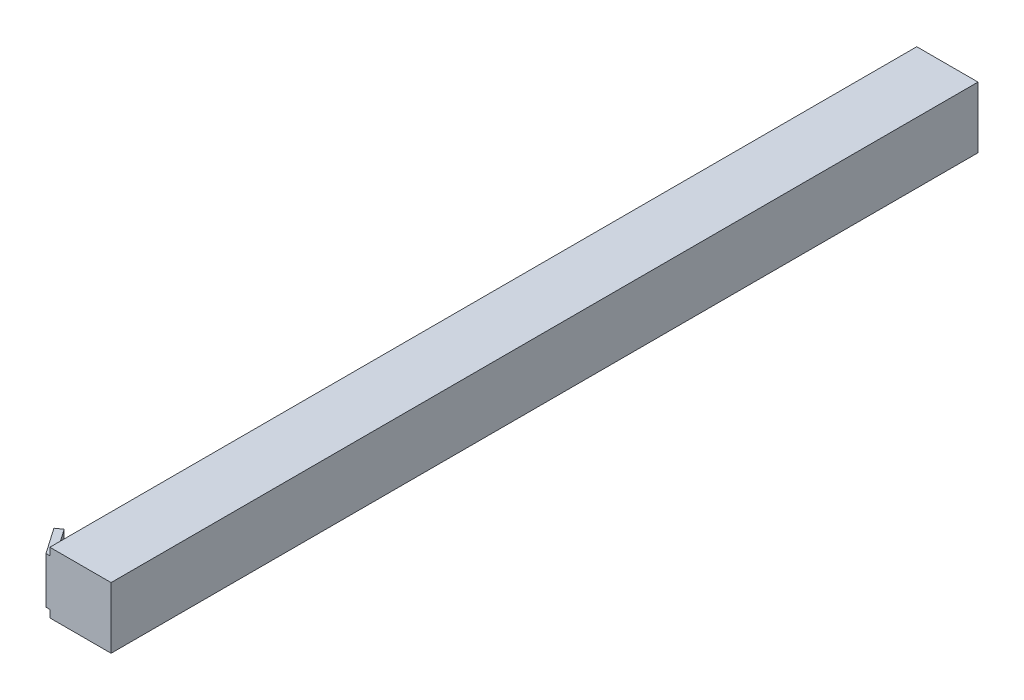
ISO-10303-21;
HEADER;
FILE_DESCRIPTION(('STEP AP214'),'2;1');
FILE_NAME('part.step','',(''),(''),'','','');
FILE_SCHEMA(('AUTOMOTIVE_DESIGN { 1 0 10303 214 1 1 1 1 }'));
ENDSEC;
DATA;
#1=APPLICATION_CONTEXT('core data for automotive mechanical design processes');
#2=APPLICATION_PROTOCOL_DEFINITION('international standard','automotive_design',2000,#1);
#3=PRODUCT_CONTEXT('',#1,'mechanical');
#4=PRODUCT('Part','Part','',(#3));
#5=PRODUCT_RELATED_PRODUCT_CATEGORY('part','',(#4));
#6=PRODUCT_DEFINITION_FORMATION('','',#4);
#7=PRODUCT_DEFINITION_CONTEXT('part definition',#1,'design');
#8=PRODUCT_DEFINITION('design','',#6,#7);
#9=PRODUCT_DEFINITION_SHAPE('','',#8);
#10=(LENGTH_UNIT() NAMED_UNIT(*) SI_UNIT(.MILLI.,.METRE.));
#11=(NAMED_UNIT(*) PLANE_ANGLE_UNIT() SI_UNIT($,.RADIAN.));
#12=(NAMED_UNIT(*) SI_UNIT($,.STERADIAN.) SOLID_ANGLE_UNIT());
#13=UNCERTAINTY_MEASURE_WITH_UNIT(LENGTH_MEASURE(1.E-05),#10,'distance_accuracy_value','');
#14=(GEOMETRIC_REPRESENTATION_CONTEXT(3) GLOBAL_UNCERTAINTY_ASSIGNED_CONTEXT((#13)) GLOBAL_UNIT_ASSIGNED_CONTEXT((#10,
#11,#12)) REPRESENTATION_CONTEXT('',''));
#15=CARTESIAN_POINT('',(0.,0.,0.));
#16=DIRECTION('',(0.,0.,1.));
#17=DIRECTION('',(1.,0.,0.));
#18=AXIS2_PLACEMENT_3D('',#15,#16,#17);
#19=CARTESIAN_POINT('',(0.,-2.,0.));
#20=DIRECTION('',(-1.,0.,0.));
#21=DIRECTION('',(0.,0.,1.));
#22=AXIS2_PLACEMENT_3D('',#19,#20,#21);
#23=PLANE('',#22);
#24=DIRECTION('',(0.,-1.,0.));
#25=VECTOR('',#24,1.);
#26=CARTESIAN_POINT('',(0.,12.6,-19.));
#27=LINE('',#26,#25);
#28=CARTESIAN_POINT('',(0.,0.000999999999999638,-19.));
#29=VERTEX_POINT('',#28);
#30=CARTESIAN_POINT('',(0.,0.,-19.));
#31=VERTEX_POINT('',#30);
#32=EDGE_CURVE('E219',#29,#31,#27,.T.);
#33=ORIENTED_EDGE('',*,*,#32,.F.);
#34=CARTESIAN_POINT('',(0.,0.000999999999999638,-20.999));
#35=DIRECTION('',(-1.,0.,0.));
#36=DIRECTION('',(0.,0.,1.));
#37=AXIS2_PLACEMENT_3D('',#34,#35,#36);
#38=CIRCLE('',#37,1.999);
#39=CARTESIAN_POINT('',(0.,2.,-20.999));
#40=VERTEX_POINT('',#39);
#41=EDGE_CURVE('E205',#29,#40,#38,.T.);
#42=ORIENTED_EDGE('',*,*,#41,.T.);
#43=DIRECTION('',(0.,0.,1.));
#44=VECTOR('',#43,1.);
#45=CARTESIAN_POINT('',(0.,2.,0.));
#46=LINE('',#45,#44);
#47=CARTESIAN_POINT('',(0.,2.,-233.));
#48=VERTEX_POINT('',#47);
#49=EDGE_CURVE('E286',#48,#40,#46,.T.);
#50=ORIENTED_EDGE('',*,*,#49,.F.);
#51=DIRECTION('',(0.,1.,0.));
#52=VECTOR('',#51,1.);
#53=CARTESIAN_POINT('',(0.,-2.,-233.));
#54=LINE('',#53,#52);
#55=CARTESIAN_POINT('',(0.,-2.,-233.));
#56=VERTEX_POINT('',#55);
#57=EDGE_CURVE('E259',#56,#48,#54,.T.);
#58=ORIENTED_EDGE('',*,*,#57,.F.);
#59=DIRECTION('',(0.,0.,1.));
#60=VECTOR('',#59,1.);
#61=CARTESIAN_POINT('',(0.,-2.,0.));
#62=LINE('',#61,#60);
#63=CARTESIAN_POINT('',(0.,-2.,2.));
#64=VERTEX_POINT('',#63);
#65=EDGE_CURVE('E239',#56,#64,#62,.T.);
#66=ORIENTED_EDGE('',*,*,#65,.T.);
#67=DIRECTION('',(0.,1.,0.));
#68=VECTOR('',#67,1.);
#69=CARTESIAN_POINT('',(0.,-2.,2.));
#70=LINE('',#69,#68);
#71=CARTESIAN_POINT('',(0.,0.,2.));
#72=VERTEX_POINT('',#71);
#73=EDGE_CURVE('E256',#64,#72,#70,.T.);
#74=ORIENTED_EDGE('',*,*,#73,.T.);
#75=DIRECTION('',(0.,0.,1.));
#76=VECTOR('',#75,1.);
#77=CARTESIAN_POINT('',(0.,0.,0.));
#78=LINE('',#77,#76);
#79=CARTESIAN_POINT('',(0.,0.,0.));
#80=VERTEX_POINT('',#79);
#81=EDGE_CURVE('E249',#80,#72,#78,.T.);
#82=ORIENTED_EDGE('',*,*,#81,.F.);
#83=EDGE_CURVE('E226',#31,#80,#78,.T.);
#84=ORIENTED_EDGE('',*,*,#83,.F.);
#85=EDGE_LOOP('',(#33,#42,#50,#58,#66,#74,#82,#84));
#86=FACE_BOUND('',#85,.T.);
#87=ADVANCED_FACE('F71',(#86),#23,.T.);
#88=CARTESIAN_POINT('',(0.,12.6,-19.));
#89=DIRECTION('',(0.,0.,1.));
#90=DIRECTION('',(1.,0.,0.));
#91=AXIS2_PLACEMENT_3D('',#88,#89,#90);
#92=PLANE('',#91);
#93=DIRECTION('',(0.,-1.,0.));
#94=VECTOR('',#93,1.);
#95=CARTESIAN_POINT('',(2.00000000000003,12.6,-19.));
#96=LINE('',#95,#94);
#97=CARTESIAN_POINT('',(2.00000000000003,0.000999999999999638,-19.));
#98=VERTEX_POINT('',#97);
#99=CARTESIAN_POINT('',(2.00000000000003,0.,-19.));
#100=VERTEX_POINT('',#99);
#101=EDGE_CURVE('E221',#98,#100,#96,.T.);
#102=ORIENTED_EDGE('',*,*,#101,.F.);
#103=DIRECTION('',(-1.,0.,0.));
#104=VECTOR('',#103,1.);
#105=CARTESIAN_POINT('',(4.,0.000999999999999638,-19.));
#106=LINE('',#105,#104);
#107=EDGE_CURVE('E208',#98,#29,#106,.T.);
#108=ORIENTED_EDGE('',*,*,#107,.T.);
#109=ORIENTED_EDGE('',*,*,#32,.T.);
#110=DIRECTION('',(-1.,0.,0.));
#111=VECTOR('',#110,1.);
#112=CARTESIAN_POINT('',(0.,0.,-19.));
#113=LINE('',#112,#111);
#114=EDGE_CURVE('E351',#100,#31,#113,.T.);
#115=ORIENTED_EDGE('',*,*,#114,.F.);
#116=EDGE_LOOP('',(#102,#108,#109,#115));
#117=FACE_BOUND('',#116,.T.);
#118=ADVANCED_FACE('F217',(#117),#92,.T.);
#119=CARTESIAN_POINT('',(2.00000000000003,12.6,0.));
#120=DIRECTION('',(-1.,0.,0.));
#121=DIRECTION('',(0.,0.,1.));
#122=AXIS2_PLACEMENT_3D('',#119,#120,#121);
#123=PLANE('',#122);
#124=CARTESIAN_POINT('',(2.00000000000003,0.000999999999999638,-20.999));
#125=DIRECTION('',(-1.,0.,0.));
#126=DIRECTION('',(0.,0.,1.));
#127=AXIS2_PLACEMENT_3D('',#124,#125,#126);
#128=CIRCLE('',#127,1.999);
#129=CARTESIAN_POINT('',(2.00000000000003,2.,-20.999));
#130=VERTEX_POINT('',#129);
#131=EDGE_CURVE('E93',#98,#130,#128,.T.);
#132=ORIENTED_EDGE('',*,*,#131,.F.);
#133=ORIENTED_EDGE('',*,*,#101,.T.);
#134=DIRECTION('',(0.,0.,-1.));
#135=VECTOR('',#134,1.);
#136=CARTESIAN_POINT('',(2.00000000000003,0.,0.));
#137=LINE('',#136,#135);
#138=CARTESIAN_POINT('',(2.,0.,-233.));
#139=VERTEX_POINT('',#138);
#140=EDGE_CURVE('E356',#100,#139,#137,.T.);
#141=ORIENTED_EDGE('',*,*,#140,.T.);
#142=DIRECTION('',(0.,-1.,0.));
#143=VECTOR('',#142,1.);
#144=CARTESIAN_POINT('',(2.,12.6,-233.));
#145=LINE('',#144,#143);
#146=CARTESIAN_POINT('',(2.,2.,-233.));
#147=VERTEX_POINT('',#146);
#148=EDGE_CURVE('E272',#147,#139,#145,.T.);
#149=ORIENTED_EDGE('',*,*,#148,.F.);
#150=DIRECTION('',(0.,0.,1.));
#151=VECTOR('',#150,1.);
#152=CARTESIAN_POINT('',(2.00000000000003,2.,0.));
#153=LINE('',#152,#151);
#154=EDGE_CURVE('E266',#147,#130,#153,.T.);
#155=ORIENTED_EDGE('',*,*,#154,.T.);
#156=EDGE_LOOP('',(#132,#133,#141,#149,#155));
#157=FACE_BOUND('',#156,.T.);
#158=ADVANCED_FACE('F270',(#157),#123,.F.);
#159=CARTESIAN_POINT('',(0.,12.599,-20.999));
#160=DIRECTION('',(-1.,0.,0.));
#161=DIRECTION('',(0.,0.,1.));
#162=AXIS2_PLACEMENT_3D('',#159,#160,#161);
#163=CIRCLE('',#162,1.999);
#164=CARTESIAN_POINT('',(0.,12.599,-19.));
#165=VERTEX_POINT('',#164);
#166=CARTESIAN_POINT('',(0.,10.6,-20.999));
#167=VERTEX_POINT('',#166);
#168=EDGE_CURVE('E85',#165,#167,#163,.F.);
#169=ORIENTED_EDGE('',*,*,#168,.F.);
#170=CARTESIAN_POINT('',(0.,12.6,-19.));
#171=VERTEX_POINT('',#170);
#172=EDGE_CURVE('E227',#171,#165,#27,.T.);
#173=ORIENTED_EDGE('',*,*,#172,.F.);
#174=DIRECTION('',(0.,0.,1.));
#175=VECTOR('',#174,1.);
#176=CARTESIAN_POINT('',(0.,12.6,-233.));
#177=LINE('',#176,#175);
#178=CARTESIAN_POINT('',(0.,12.6,0.));
#179=VERTEX_POINT('',#178);
#180=EDGE_CURVE('E279',#171,#179,#177,.T.);
#181=ORIENTED_EDGE('',*,*,#180,.T.);
#182=DIRECTION('',(0.,0.,-1.));
#183=VECTOR('',#182,1.);
#184=CARTESIAN_POINT('',(0.,12.6,0.));
#185=LINE('',#184,#183);
#186=CARTESIAN_POINT('',(0.,12.6,2.));
#187=VERTEX_POINT('',#186);
#188=EDGE_CURVE('E253',#187,#179,#185,.T.);
#189=ORIENTED_EDGE('',*,*,#188,.F.);
#190=DIRECTION('',(0.,-1.,0.));
#191=VECTOR('',#190,1.);
#192=CARTESIAN_POINT('',(0.,14.6,2.));
#193=LINE('',#192,#191);
#194=CARTESIAN_POINT('',(0.,14.6,2.));
#195=VERTEX_POINT('',#194);
#196=EDGE_CURVE('E302',#195,#187,#193,.T.);
#197=ORIENTED_EDGE('',*,*,#196,.F.);
#198=DIRECTION('',(0.,0.,1.));
#199=VECTOR('',#198,1.);
#200=CARTESIAN_POINT('',(0.,14.6,-233.));
#201=LINE('',#200,#199);
#202=CARTESIAN_POINT('',(0.,14.6,-233.));
#203=VERTEX_POINT('',#202);
#204=EDGE_CURVE('E291',#203,#195,#201,.T.);
#205=ORIENTED_EDGE('',*,*,#204,.F.);
#206=CARTESIAN_POINT('',(0.,10.6,-233.));
#207=VERTEX_POINT('',#206);
#208=EDGE_CURVE('E246',#207,#203,#54,.T.);
#209=ORIENTED_EDGE('',*,*,#208,.F.);
#210=DIRECTION('',(0.,0.,-1.));
#211=VECTOR('',#210,1.);
#212=CARTESIAN_POINT('',(0.,10.6,0.));
#213=LINE('',#212,#211);
#214=EDGE_CURVE('E388',#167,#207,#213,.T.);
#215=ORIENTED_EDGE('',*,*,#214,.F.);
#216=EDGE_LOOP('',(#169,#173,#181,#189,#197,#205,#209,#215));
#217=FACE_BOUND('',#216,.T.);
#218=ADVANCED_FACE('F393',(#217),#23,.T.);
#219=ORIENTED_EDGE('',*,*,#172,.T.);
#220=DIRECTION('',(-1.,0.,0.));
#221=VECTOR('',#220,1.);
#222=CARTESIAN_POINT('',(4.,12.599,-19.));
#223=LINE('',#222,#221);
#224=CARTESIAN_POINT('',(2.00000000000003,12.599,-19.));
#225=VERTEX_POINT('',#224);
#226=EDGE_CURVE('E213',#225,#165,#223,.T.);
#227=ORIENTED_EDGE('',*,*,#226,.F.);
#228=CARTESIAN_POINT('',(2.00000000000003,12.6,-19.));
#229=VERTEX_POINT('',#228);
#230=EDGE_CURVE('E228',#229,#225,#96,.T.);
#231=ORIENTED_EDGE('',*,*,#230,.F.);
#232=DIRECTION('',(-1.,0.,0.));
#233=VECTOR('',#232,1.);
#234=CARTESIAN_POINT('',(0.,12.6,-19.));
#235=LINE('',#234,#233);
#236=EDGE_CURVE('E352',#229,#171,#235,.T.);
#237=ORIENTED_EDGE('',*,*,#236,.T.);
#238=EDGE_LOOP('',(#219,#227,#231,#237));
#239=FACE_BOUND('',#238,.T.);
#240=ADVANCED_FACE('F414',(#239),#92,.T.);
#241=ORIENTED_EDGE('',*,*,#230,.T.);
#242=CARTESIAN_POINT('',(2.00000000000003,12.599,-20.999));
#243=DIRECTION('',(-1.,0.,0.));
#244=DIRECTION('',(0.,0.,1.));
#245=AXIS2_PLACEMENT_3D('',#242,#243,#244);
#246=CIRCLE('',#245,1.999);
#247=CARTESIAN_POINT('',(2.00000000000001,10.6,-20.999));
#248=VERTEX_POINT('',#247);
#249=EDGE_CURVE('E384',#225,#248,#246,.F.);
#250=ORIENTED_EDGE('',*,*,#249,.T.);
#251=DIRECTION('',(0.,0.,-1.));
#252=VECTOR('',#251,1.);
#253=CARTESIAN_POINT('',(2.00000000000003,10.6,0.));
#254=LINE('',#253,#252);
#255=CARTESIAN_POINT('',(2.,10.6,-233.));
#256=VERTEX_POINT('',#255);
#257=EDGE_CURVE('E264',#248,#256,#254,.T.);
#258=ORIENTED_EDGE('',*,*,#257,.T.);
#259=CARTESIAN_POINT('',(2.,12.6,-233.));
#260=VERTEX_POINT('',#259);
#261=EDGE_CURVE('E360',#260,#256,#145,.T.);
#262=ORIENTED_EDGE('',*,*,#261,.F.);
#263=DIRECTION('',(0.,0.,-1.));
#264=VECTOR('',#263,1.);
#265=CARTESIAN_POINT('',(2.00000000000003,12.6,0.));
#266=LINE('',#265,#264);
#267=EDGE_CURVE('E355',#229,#260,#266,.T.);
#268=ORIENTED_EDGE('',*,*,#267,.F.);
#269=EDGE_LOOP('',(#241,#250,#258,#262,#268));
#270=FACE_BOUND('',#269,.T.);
#271=ADVANCED_FACE('F380',(#270),#123,.F.);
#272=CARTESIAN_POINT('',(4.,10.6,0.));
#273=DIRECTION('',(0.,1.,0.));
#274=DIRECTION('',(0.,0.,1.));
#275=AXIS2_PLACEMENT_3D('',#272,#273,#274);
#276=PLANE('',#275);
#277=DIRECTION('',(-1.,0.,0.));
#278=VECTOR('',#277,1.);
#279=CARTESIAN_POINT('',(4.,10.6,-20.999));
#280=LINE('',#279,#278);
#281=EDGE_CURVE('E12',#167,#248,#280,.F.);
#282=ORIENTED_EDGE('',*,*,#281,.F.);
#283=ORIENTED_EDGE('',*,*,#214,.T.);
#284=DIRECTION('',(-1.,0.,0.));
#285=VECTOR('',#284,1.);
#286=CARTESIAN_POINT('',(4.,10.6,-233.));
#287=LINE('',#286,#285);
#288=EDGE_CURVE('E280',#256,#207,#287,.T.);
#289=ORIENTED_EDGE('',*,*,#288,.F.);
#290=ORIENTED_EDGE('',*,*,#257,.F.);
#291=EDGE_LOOP('',(#282,#283,#289,#290));
#292=FACE_BOUND('',#291,.T.);
#293=ADVANCED_FACE('F386',(#292),#276,.F.);
#294=CARTESIAN_POINT('',(4.,2.,0.));
#295=DIRECTION('',(0.,-1.,0.));
#296=DIRECTION('',(0.,0.,-1.));
#297=AXIS2_PLACEMENT_3D('',#294,#295,#296);
#298=PLANE('',#297);
#299=DIRECTION('',(-1.,0.,0.));
#300=VECTOR('',#299,1.);
#301=CARTESIAN_POINT('',(4.,2.,-20.999));
#302=LINE('',#301,#300);
#303=EDGE_CURVE('E79',#130,#40,#302,.T.);
#304=ORIENTED_EDGE('',*,*,#303,.F.);
#305=ORIENTED_EDGE('',*,*,#154,.F.);
#306=DIRECTION('',(-1.,0.,0.));
#307=VECTOR('',#306,1.);
#308=CARTESIAN_POINT('',(4.,2.,-233.));
#309=LINE('',#308,#307);
#310=EDGE_CURVE('E276',#147,#48,#309,.T.);
#311=ORIENTED_EDGE('',*,*,#310,.T.);
#312=ORIENTED_EDGE('',*,*,#49,.T.);
#313=EDGE_LOOP('',(#304,#305,#311,#312));
#314=FACE_BOUND('',#313,.T.);
#315=ADVANCED_FACE('F275',(#314),#298,.F.);
#316=CARTESIAN_POINT('',(0.,12.6,0.));
#317=DIRECTION('',(0.,1.,0.));
#318=DIRECTION('',(0.,0.,1.));
#319=AXIS2_PLACEMENT_3D('',#316,#317,#318);
#320=PLANE('',#319);
#321=DIRECTION('',(1.,0.,0.));
#322=VECTOR('',#321,1.);
#323=CARTESIAN_POINT('',(0.,12.6,2.));
#324=LINE('',#323,#322);
#325=CARTESIAN_POINT('',(-1.0456065278763,12.6,2.));
#326=VERTEX_POINT('',#325);
#327=EDGE_CURVE('E309',#326,#187,#324,.T.);
#328=ORIENTED_EDGE('',*,*,#327,.T.);
#329=ORIENTED_EDGE('',*,*,#188,.T.);
#330=DIRECTION('',(-0.570693062917517,0.,-0.82116345993829));
#331=VECTOR('',#330,1.);
#332=CARTESIAN_POINT('',(0.,12.6,0.));
#333=LINE('',#332,#331);
#334=CARTESIAN_POINT('',(-4.28019797188137,12.6,-6.15872594953717));
#335=VERTEX_POINT('',#334);
#336=EDGE_CURVE('E317',#179,#335,#333,.T.);
#337=ORIENTED_EDGE('',*,*,#336,.T.);
#338=DIRECTION('',(-0.82116345993829,0.,0.570693062917517));
#339=VECTOR('',#338,1.);
#340=CARTESIAN_POINT('',(-4.28019797188138,12.6,-6.15872594953717));
#341=LINE('',#340,#339);
#342=CARTESIAN_POINT('',(-5.92252489175796,12.6,-5.01733982370213));
#343=VERTEX_POINT('',#342);
#344=EDGE_CURVE('E319',#335,#343,#341,.T.);
#345=ORIENTED_EDGE('',*,*,#344,.T.);
#346=DIRECTION('',(0.570693062917517,0.,0.82116345993829));
#347=VECTOR('',#346,1.);
#348=CARTESIAN_POINT('',(-1.64232691987658,12.6,1.14138612583504));
#349=LINE('',#348,#347);
#350=EDGE_CURVE('E321',#343,#326,#349,.T.);
#351=ORIENTED_EDGE('',*,*,#350,.T.);
#352=EDGE_LOOP('',(#328,#329,#337,#345,#351));
#353=FACE_BOUND('',#352,.T.);
#354=ADVANCED_FACE('F417',(#353),#320,.T.);
#355=CARTESIAN_POINT('',(0.,0.,0.));
#356=DIRECTION('',(0.,1.,0.));
#357=DIRECTION('',(0.,0.,1.));
#358=AXIS2_PLACEMENT_3D('',#355,#356,#357);
#359=PLANE('',#358);
#360=CARTESIAN_POINT('',(0.127994310885294,0.,-14.4714396699896));
#361=DIRECTION('',(0.,1.,0.));
#362=DIRECTION('',(0.,0.,1.));
#363=AXIS2_PLACEMENT_3D('',#360,#361,#362);
#364=CIRCLE('',#363,14.4720056891147);
#365=CARTESIAN_POINT('',(14.6,0.,-14.4714396699896));
#366=VERTEX_POINT('',#365);
#367=EDGE_CURVE('E329',#366,#80,#364,.F.);
#368=ORIENTED_EDGE('',*,*,#367,.F.);
#369=DIRECTION('',(0.,0.,1.));
#370=VECTOR('',#369,1.);
#371=CARTESIAN_POINT('',(14.6,0.,0.));
#372=LINE('',#371,#370);
#373=CARTESIAN_POINT('',(14.6,0.,-233.));
#374=VERTEX_POINT('',#373);
#375=EDGE_CURVE('E326',#374,#366,#372,.T.);
#376=ORIENTED_EDGE('',*,*,#375,.F.);
#377=DIRECTION('',(1.,0.,0.));
#378=VECTOR('',#377,1.);
#379=CARTESIAN_POINT('',(0.,0.,-233.));
#380=LINE('',#379,#378);
#381=EDGE_CURVE('E231',#139,#374,#380,.T.);
#382=ORIENTED_EDGE('',*,*,#381,.F.);
#383=ORIENTED_EDGE('',*,*,#140,.F.);
#384=ORIENTED_EDGE('',*,*,#114,.T.);
#385=ORIENTED_EDGE('',*,*,#83,.T.);
#386=EDGE_LOOP('',(#368,#376,#382,#383,#384,#385));
#387=FACE_BOUND('',#386,.T.);
#388=ADVANCED_FACE('F366',(#387),#359,.T.);
#389=CARTESIAN_POINT('',(0.,-2.,-233.));
#390=DIRECTION('',(0.,0.,1.));
#391=DIRECTION('',(1.,0.,0.));
#392=AXIS2_PLACEMENT_3D('',#389,#390,#391);
#393=PLANE('',#392);
#394=ORIENTED_EDGE('',*,*,#57,.T.);
#395=ORIENTED_EDGE('',*,*,#310,.F.);
#396=ORIENTED_EDGE('',*,*,#148,.T.);
#397=ORIENTED_EDGE('',*,*,#381,.T.);
#398=DIRECTION('',(0.,-1.,0.));
#399=VECTOR('',#398,1.);
#400=CARTESIAN_POINT('',(14.6,12.6,-233.));
#401=LINE('',#400,#399);
#402=CARTESIAN_POINT('',(14.6,12.6,-233.));
#403=VERTEX_POINT('',#402);
#404=EDGE_CURVE('E349',#403,#374,#401,.T.);
#405=ORIENTED_EDGE('',*,*,#404,.F.);
#406=DIRECTION('',(-1.,0.,0.));
#407=VECTOR('',#406,1.);
#408=CARTESIAN_POINT('',(0.,12.6,-233.));
#409=LINE('',#408,#407);
#410=EDGE_CURVE('E283',#403,#260,#409,.T.);
#411=ORIENTED_EDGE('',*,*,#410,.T.);
#412=ORIENTED_EDGE('',*,*,#261,.T.);
#413=ORIENTED_EDGE('',*,*,#288,.T.);
#414=ORIENTED_EDGE('',*,*,#208,.T.);
#415=DIRECTION('',(-1.,0.,0.));
#416=VECTOR('',#415,1.);
#417=CARTESIAN_POINT('',(0.,14.6,-233.));
#418=LINE('',#417,#416);
#419=CARTESIAN_POINT('',(16.6,14.6,-233.));
#420=VERTEX_POINT('',#419);
#421=EDGE_CURVE('E300',#420,#203,#418,.T.);
#422=ORIENTED_EDGE('',*,*,#421,.F.);
#423=DIRECTION('',(0.,1.,0.));
#424=VECTOR('',#423,1.);
#425=CARTESIAN_POINT('',(16.6,-2.,-233.));
#426=LINE('',#425,#424);
#427=CARTESIAN_POINT('',(16.6,-2.,-233.));
#428=VERTEX_POINT('',#427);
#429=EDGE_CURVE('E251',#428,#420,#426,.T.);
#430=ORIENTED_EDGE('',*,*,#429,.F.);
#431=DIRECTION('',(1.,0.,0.));
#432=VECTOR('',#431,1.);
#433=CARTESIAN_POINT('',(0.,-2.,-233.));
#434=LINE('',#433,#432);
#435=EDGE_CURVE('E236',#56,#428,#434,.T.);
#436=ORIENTED_EDGE('',*,*,#435,.F.);
#437=EDGE_LOOP('',(#394,#395,#396,#397,#405,#411,#412,#413,#414,#422,#430,#436));
#438=FACE_BOUND('',#437,.T.);
#439=ADVANCED_FACE('F73',(#438),#393,.F.);
#440=CARTESIAN_POINT('',(16.6,-2.,0.));
#441=DIRECTION('',(-1.,0.,0.));
#442=DIRECTION('',(0.,0.,1.));
#443=AXIS2_PLACEMENT_3D('',#440,#441,#442);
#444=PLANE('',#443);
#445=ORIENTED_EDGE('',*,*,#429,.T.);
#446=DIRECTION('',(0.,0.,-1.));
#447=VECTOR('',#446,1.);
#448=CARTESIAN_POINT('',(16.6,14.6,-233.));
#449=LINE('',#448,#447);
#450=CARTESIAN_POINT('',(16.6,14.6,2.));
#451=VERTEX_POINT('',#450);
#452=EDGE_CURVE('E297',#451,#420,#449,.T.);
#453=ORIENTED_EDGE('',*,*,#452,.F.);
#454=DIRECTION('',(0.,1.,0.));
#455=VECTOR('',#454,1.);
#456=CARTESIAN_POINT('',(16.6,-2.,2.));
#457=LINE('',#456,#455);
#458=CARTESIAN_POINT('',(16.6,-2.,2.));
#459=VERTEX_POINT('',#458);
#460=EDGE_CURVE('E254',#459,#451,#457,.T.);
#461=ORIENTED_EDGE('',*,*,#460,.F.);
#462=DIRECTION('',(0.,0.,1.));
#463=VECTOR('',#462,1.);
#464=CARTESIAN_POINT('',(16.6,-2.,0.));
#465=LINE('',#464,#463);
#466=EDGE_CURVE('E244',#428,#459,#465,.T.);
#467=ORIENTED_EDGE('',*,*,#466,.F.);
#468=EDGE_LOOP('',(#445,#453,#461,#467));
#469=FACE_BOUND('',#468,.T.);
#470=ADVANCED_FACE('F401',(#469),#444,.F.);
#471=CARTESIAN_POINT('',(0.,-2.,2.));
#472=DIRECTION('',(0.,0.,-1.));
#473=DIRECTION('',(-1.,0.,0.));
#474=AXIS2_PLACEMENT_3D('',#471,#472,#473);
#475=PLANE('',#474);
#476=ORIENTED_EDGE('',*,*,#460,.T.);
#477=DIRECTION('',(1.,0.,0.));
#478=VECTOR('',#477,1.);
#479=CARTESIAN_POINT('',(0.,14.6,2.));
#480=LINE('',#479,#478);
#481=EDGE_CURVE('E294',#195,#451,#480,.T.);
#482=ORIENTED_EDGE('',*,*,#481,.F.);
#483=ORIENTED_EDGE('',*,*,#196,.T.);
#484=ORIENTED_EDGE('',*,*,#327,.F.);
#485=DIRECTION('',(0.,-1.,0.));
#486=VECTOR('',#485,1.);
#487=CARTESIAN_POINT('',(-1.0456065278763,12.6,2.));
#488=LINE('',#487,#486);
#489=CARTESIAN_POINT('',(-1.0456065278763,0.,2.));
#490=VERTEX_POINT('',#489);
#491=EDGE_CURVE('E323',#326,#490,#488,.T.);
#492=ORIENTED_EDGE('',*,*,#491,.T.);
#493=DIRECTION('',(1.,0.,0.));
#494=VECTOR('',#493,1.);
#495=CARTESIAN_POINT('',(0.,0.,2.));
#496=LINE('',#495,#494);
#497=EDGE_CURVE('E308',#490,#72,#496,.T.);
#498=ORIENTED_EDGE('',*,*,#497,.T.);
#499=ORIENTED_EDGE('',*,*,#73,.F.);
#500=DIRECTION('',(-1.,0.,0.));
#501=VECTOR('',#500,1.);
#502=CARTESIAN_POINT('',(0.,-2.,2.));
#503=LINE('',#502,#501);
#504=EDGE_CURVE('E242',#459,#64,#503,.T.);
#505=ORIENTED_EDGE('',*,*,#504,.F.);
#506=EDGE_LOOP('',(#476,#482,#483,#484,#492,#498,#499,#505));
#507=FACE_BOUND('',#506,.T.);
#508=ADVANCED_FACE('F438',(#507),#475,.F.);
#509=CARTESIAN_POINT('',(0.,-2.,0.));
#510=DIRECTION('',(0.,1.,0.));
#511=DIRECTION('',(0.,0.,1.));
#512=AXIS2_PLACEMENT_3D('',#509,#510,#511);
#513=PLANE('',#512);
#514=ORIENTED_EDGE('',*,*,#435,.T.);
#515=ORIENTED_EDGE('',*,*,#466,.T.);
#516=ORIENTED_EDGE('',*,*,#504,.T.);
#517=ORIENTED_EDGE('',*,*,#65,.F.);
#518=EDGE_LOOP('',(#514,#515,#516,#517));
#519=FACE_BOUND('',#518,.T.);
#520=ADVANCED_FACE('F405',(#519),#513,.F.);
#521=CARTESIAN_POINT('',(14.6,12.6,0.));
#522=DIRECTION('',(1.,0.,0.));
#523=DIRECTION('',(0.,0.,-1.));
#524=AXIS2_PLACEMENT_3D('',#521,#522,#523);
#525=PLANE('',#524);
#526=ORIENTED_EDGE('',*,*,#375,.T.);
#527=DIRECTION('',(0.,-1.,0.));
#528=VECTOR('',#527,1.);
#529=CARTESIAN_POINT('',(14.6,12.6,-14.4714396699896));
#530=LINE('',#529,#528);
#531=CARTESIAN_POINT('',(14.6,12.6,-14.4714396699896));
#532=VERTEX_POINT('',#531);
#533=EDGE_CURVE('E347',#532,#366,#530,.T.);
#534=ORIENTED_EDGE('',*,*,#533,.F.);
#535=DIRECTION('',(0.,0.,1.));
#536=VECTOR('',#535,1.);
#537=CARTESIAN_POINT('',(14.6,12.6,0.));
#538=LINE('',#537,#536);
#539=EDGE_CURVE('E312',#403,#532,#538,.T.);
#540=ORIENTED_EDGE('',*,*,#539,.F.);
#541=ORIENTED_EDGE('',*,*,#404,.T.);
#542=EDGE_LOOP('',(#526,#534,#540,#541));
#543=FACE_BOUND('',#542,.T.);
#544=ADVANCED_FACE('F372',(#543),#525,.F.);
#545=CARTESIAN_POINT('',(0.127994310885294,12.6,-14.4714396699896));
#546=DIRECTION('',(0.,-1.,0.));
#547=DIRECTION('',(0.,0.,-1.));
#548=AXIS2_PLACEMENT_3D('',#545,#546,#547);
#549=CYLINDRICAL_SURFACE('',#548,14.4720056891147);
#550=ORIENTED_EDGE('',*,*,#367,.T.);
#551=DIRECTION('',(0.,-1.,0.));
#552=VECTOR('',#551,1.);
#553=CARTESIAN_POINT('',(0.,12.6,0.));
#554=LINE('',#553,#552);
#555=EDGE_CURVE('E344',#179,#80,#554,.T.);
#556=ORIENTED_EDGE('',*,*,#555,.F.);
#557=CARTESIAN_POINT('',(0.127994310885294,12.6,-14.4714396699896));
#558=DIRECTION('',(0.,1.,0.));
#559=DIRECTION('',(0.,0.,1.));
#560=AXIS2_PLACEMENT_3D('',#557,#558,#559);
#561=CIRCLE('',#560,14.4720056891147);
#562=EDGE_CURVE('E315',#532,#179,#561,.F.);
#563=ORIENTED_EDGE('',*,*,#562,.F.);
#564=ORIENTED_EDGE('',*,*,#533,.T.);
#565=EDGE_LOOP('',(#550,#556,#563,#564));
#566=FACE_BOUND('',#565,.T.);
#567=ADVANCED_FACE('F422',(#566),#549,.F.);
#568=CARTESIAN_POINT('',(0.,12.6,0.));
#569=DIRECTION('',(-0.82116345993829,0.,0.570693062917517));
#570=DIRECTION('',(0.570693062917517,0.,0.82116345993829));
#571=AXIS2_PLACEMENT_3D('',#568,#569,#570);
#572=PLANE('',#571);
#573=DIRECTION('',(-0.570693062917517,0.,-0.82116345993829));
#574=VECTOR('',#573,1.);
#575=CARTESIAN_POINT('',(0.,0.,0.));
#576=LINE('',#575,#574);
#577=CARTESIAN_POINT('',(-4.28019797188137,0.,-6.15872594953717));
#578=VERTEX_POINT('',#577);
#579=EDGE_CURVE('E331',#80,#578,#576,.T.);
#580=ORIENTED_EDGE('',*,*,#579,.T.);
#581=DIRECTION('',(0.,-1.,0.));
#582=VECTOR('',#581,1.);
#583=CARTESIAN_POINT('',(-4.28019797188137,12.6,-6.15872594953717));
#584=LINE('',#583,#582);
#585=EDGE_CURVE('E341',#335,#578,#584,.T.);
#586=ORIENTED_EDGE('',*,*,#585,.F.);
#587=ORIENTED_EDGE('',*,*,#336,.F.);
#588=ORIENTED_EDGE('',*,*,#555,.T.);
#589=EDGE_LOOP('',(#580,#586,#587,#588));
#590=FACE_BOUND('',#589,.T.);
#591=ADVANCED_FACE('F425',(#590),#572,.F.);
#592=CARTESIAN_POINT('',(-4.28019797188138,12.6,-6.15872594953717));
#593=DIRECTION('',(0.570693062917517,0.,0.821163459938289));
#594=DIRECTION('',(0.82116345993829,0.,-0.570693062917517));
#595=AXIS2_PLACEMENT_3D('',#592,#593,#594);
#596=PLANE('',#595);
#597=DIRECTION('',(-0.82116345993829,0.,0.570693062917517));
#598=VECTOR('',#597,1.);
#599=CARTESIAN_POINT('',(-4.28019797188138,0.,-6.15872594953717));
#600=LINE('',#599,#598);
#601=CARTESIAN_POINT('',(-5.92252489175796,0.,-5.01733982370213));
#602=VERTEX_POINT('',#601);
#603=EDGE_CURVE('E333',#578,#602,#600,.T.);
#604=ORIENTED_EDGE('',*,*,#603,.T.);
#605=DIRECTION('',(0.,-1.,0.));
#606=VECTOR('',#605,1.);
#607=CARTESIAN_POINT('',(-5.92252489175796,12.6,-5.01733982370213));
#608=LINE('',#607,#606);
#609=EDGE_CURVE('E338',#343,#602,#608,.T.);
#610=ORIENTED_EDGE('',*,*,#609,.F.);
#611=ORIENTED_EDGE('',*,*,#344,.F.);
#612=ORIENTED_EDGE('',*,*,#585,.T.);
#613=EDGE_LOOP('',(#604,#610,#611,#612));
#614=FACE_BOUND('',#613,.T.);
#615=ADVANCED_FACE('F430',(#614),#596,.F.);
#616=CARTESIAN_POINT('',(-1.64232691987658,12.6,1.14138612583504));
#617=DIRECTION('',(0.82116345993829,0.,-0.570693062917517));
#618=DIRECTION('',(-0.570693062917517,0.,-0.82116345993829));
#619=AXIS2_PLACEMENT_3D('',#616,#617,#618);
#620=PLANE('',#619);
#621=DIRECTION('',(0.570693062917517,0.,0.82116345993829));
#622=VECTOR('',#621,1.);
#623=CARTESIAN_POINT('',(-1.64232691987658,0.,1.14138612583504));
#624=LINE('',#623,#622);
#625=EDGE_CURVE('E313',#602,#490,#624,.T.);
#626=ORIENTED_EDGE('',*,*,#625,.T.);
#627=ORIENTED_EDGE('',*,*,#491,.F.);
#628=ORIENTED_EDGE('',*,*,#350,.F.);
#629=ORIENTED_EDGE('',*,*,#609,.T.);
#630=EDGE_LOOP('',(#626,#627,#628,#629));
#631=FACE_BOUND('',#630,.T.);
#632=ADVANCED_FACE('F434',(#631),#620,.F.);
#633=CARTESIAN_POINT('',(0.,0.,0.));
#634=DIRECTION('',(0.,1.,0.));
#635=DIRECTION('',(0.,0.,1.));
#636=AXIS2_PLACEMENT_3D('',#633,#634,#635);
#637=PLANE('',#636);
#638=ORIENTED_EDGE('',*,*,#81,.T.);
#639=ORIENTED_EDGE('',*,*,#497,.F.);
#640=ORIENTED_EDGE('',*,*,#625,.F.);
#641=ORIENTED_EDGE('',*,*,#603,.F.);
#642=ORIENTED_EDGE('',*,*,#579,.F.);
#643=EDGE_LOOP('',(#638,#639,#640,#641,#642));
#644=FACE_BOUND('',#643,.T.);
#645=ADVANCED_FACE('F440',(#644),#637,.F.);
#646=CARTESIAN_POINT('',(0.,12.6,0.));
#647=DIRECTION('',(0.,1.,0.));
#648=DIRECTION('',(0.,0.,1.));
#649=AXIS2_PLACEMENT_3D('',#646,#647,#648);
#650=PLANE('',#649);
#651=ORIENTED_EDGE('',*,*,#236,.F.);
#652=ORIENTED_EDGE('',*,*,#267,.T.);
#653=ORIENTED_EDGE('',*,*,#410,.F.);
#654=ORIENTED_EDGE('',*,*,#539,.T.);
#655=ORIENTED_EDGE('',*,*,#562,.T.);
#656=ORIENTED_EDGE('',*,*,#180,.F.);
#657=EDGE_LOOP('',(#651,#652,#653,#654,#655,#656));
#658=FACE_BOUND('',#657,.T.);
#659=ADVANCED_FACE('F376',(#658),#650,.F.);
#660=CARTESIAN_POINT('',(0.,14.6,0.));
#661=DIRECTION('',(0.,1.,0.));
#662=DIRECTION('',(0.,0.,1.));
#663=AXIS2_PLACEMENT_3D('',#660,#661,#662);
#664=PLANE('',#663);
#665=ORIENTED_EDGE('',*,*,#204,.T.);
#666=ORIENTED_EDGE('',*,*,#481,.T.);
#667=ORIENTED_EDGE('',*,*,#452,.T.);
#668=ORIENTED_EDGE('',*,*,#421,.T.);
#669=EDGE_LOOP('',(#665,#666,#667,#668));
#670=FACE_BOUND('',#669,.T.);
#671=ADVANCED_FACE('F396',(#670),#664,.T.);
#672=CARTESIAN_POINT('',(4.,0.000999999999999638,-20.999));
#673=DIRECTION('',(-1.,0.,0.));
#674=DIRECTION('',(0.,0.,1.));
#675=AXIS2_PLACEMENT_3D('',#672,#673,#674);
#676=CYLINDRICAL_SURFACE('',#675,1.999);
#677=ORIENTED_EDGE('',*,*,#131,.T.);
#678=ORIENTED_EDGE('',*,*,#303,.T.);
#679=ORIENTED_EDGE('',*,*,#41,.F.);
#680=ORIENTED_EDGE('',*,*,#107,.F.);
#681=EDGE_LOOP('',(#677,#678,#679,#680));
#682=FACE_BOUND('',#681,.T.);
#683=ADVANCED_FACE('F207',(#682),#676,.T.);
#684=CARTESIAN_POINT('',(4.,12.599,-20.999));
#685=DIRECTION('',(-1.,0.,0.));
#686=DIRECTION('',(0.,0.,1.));
#687=AXIS2_PLACEMENT_3D('',#684,#685,#686);
#688=CYLINDRICAL_SURFACE('',#687,1.999);
#689=ORIENTED_EDGE('',*,*,#226,.T.);
#690=ORIENTED_EDGE('',*,*,#168,.T.);
#691=ORIENTED_EDGE('',*,*,#281,.T.);
#692=ORIENTED_EDGE('',*,*,#249,.F.);
#693=EDGE_LOOP('',(#689,#690,#691,#692));
#694=FACE_BOUND('',#693,.T.);
#695=ADVANCED_FACE('F412',(#694),#688,.T.);
#696=CLOSED_SHELL('',(#87,#118,#158,#218,#240,#271,#293,#315,#354,#388,#439,#470,#508,#520,#544,
#567,#591,#615,#632,#645,#659,#671,#683,#695));
#697=MANIFOLD_SOLID_BREP('B2',#696);
#698=ADVANCED_BREP_SHAPE_REPRESENTATION('',(#18,#697),#14);
#699=SHAPE_DEFINITION_REPRESENTATION(#9,#698);
ENDSEC;
END-ISO-10303-21;
